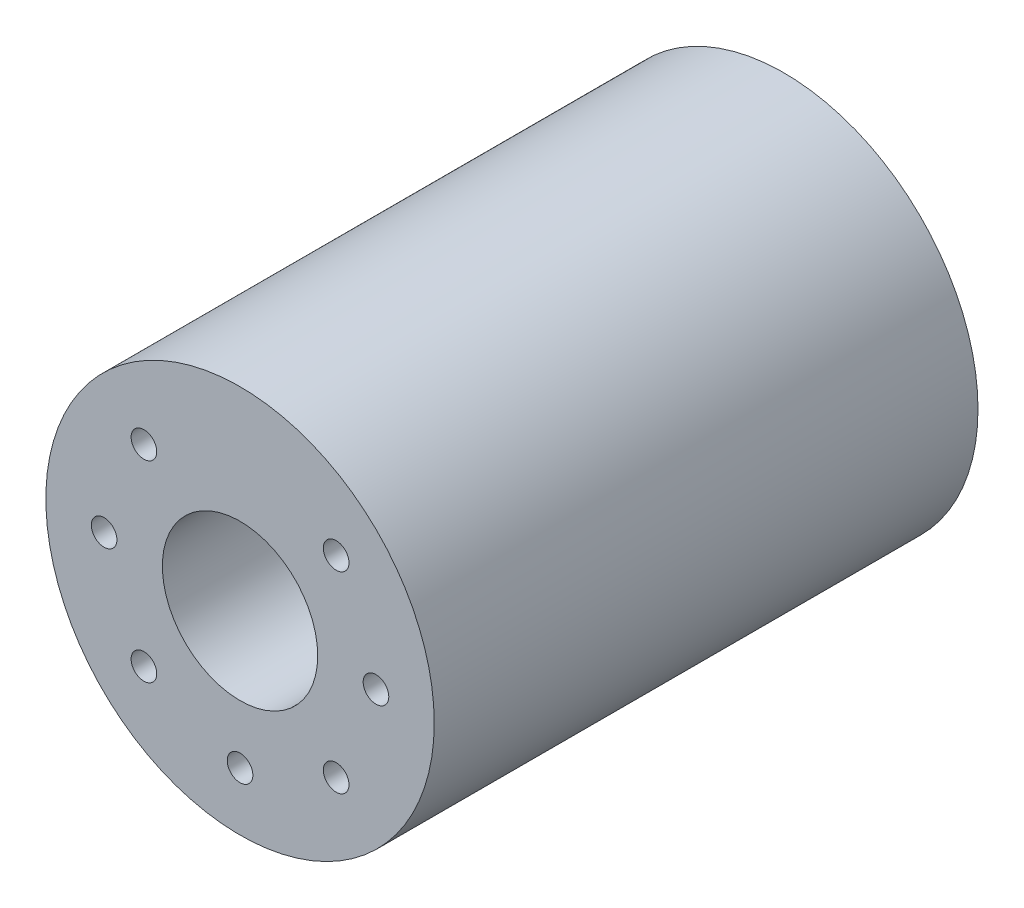
ISO-10303-21;
HEADER;
FILE_DESCRIPTION(('STEP AP214'),'2;1');
FILE_NAME('part.step','',(''),(''),'','','');
FILE_SCHEMA(('AUTOMOTIVE_DESIGN { 1 0 10303 214 1 1 1 1 }'));
ENDSEC;
DATA;
#1=APPLICATION_CONTEXT('core data for automotive mechanical design processes');
#2=APPLICATION_PROTOCOL_DEFINITION('international standard','automotive_design',2000,#1);
#3=PRODUCT_CONTEXT('',#1,'mechanical');
#4=PRODUCT('Part','Part','',(#3));
#5=PRODUCT_RELATED_PRODUCT_CATEGORY('part','',(#4));
#6=PRODUCT_DEFINITION_FORMATION('','',#4);
#7=PRODUCT_DEFINITION_CONTEXT('part definition',#1,'design');
#8=PRODUCT_DEFINITION('design','',#6,#7);
#9=PRODUCT_DEFINITION_SHAPE('','',#8);
#10=(LENGTH_UNIT() NAMED_UNIT(*) SI_UNIT(.MILLI.,.METRE.));
#11=(NAMED_UNIT(*) PLANE_ANGLE_UNIT() SI_UNIT($,.RADIAN.));
#12=(NAMED_UNIT(*) SI_UNIT($,.STERADIAN.) SOLID_ANGLE_UNIT());
#13=UNCERTAINTY_MEASURE_WITH_UNIT(LENGTH_MEASURE(1.E-05),#10,'distance_accuracy_value','');
#14=(GEOMETRIC_REPRESENTATION_CONTEXT(3) GLOBAL_UNCERTAINTY_ASSIGNED_CONTEXT((#13)) GLOBAL_UNIT_ASSIGNED_CONTEXT((#10,
#11,#12)) REPRESENTATION_CONTEXT('',''));
#15=CARTESIAN_POINT('',(0.,0.,0.));
#16=DIRECTION('',(0.,0.,1.));
#17=DIRECTION('',(1.,0.,0.));
#18=AXIS2_PLACEMENT_3D('',#15,#16,#17);
#19=CARTESIAN_POINT('',(0.,0.,70.));
#20=DIRECTION('',(0.,0.,1.));
#21=DIRECTION('',(1.,0.,0.));
#22=AXIS2_PLACEMENT_3D('',#19,#20,#21);
#23=PLANE('',#22);
#24=CARTESIAN_POINT('',(17.5,0.,70.));
#25=DIRECTION('',(0.,0.,1.));
#26=DIRECTION('',(1.,0.,0.));
#27=AXIS2_PLACEMENT_3D('',#24,#25,#26);
#28=CIRCLE('',#27,1.65);
#29=CARTESIAN_POINT('',(19.15,0.,70.));
#30=VERTEX_POINT('',#29);
#31=EDGE_CURVE('E59',#30,#30,#28,.T.);
#32=ORIENTED_EDGE('',*,*,#31,.F.);
#33=EDGE_LOOP('',(#32));
#34=FACE_BOUND('',#33,.T.);
#35=CARTESIAN_POINT('',(12.3743686707645,-12.3743686707646,70.));
#36=DIRECTION('',(0.,0.,1.));
#37=DIRECTION('',(1.,0.,0.));
#38=AXIS2_PLACEMENT_3D('',#35,#36,#37);
#39=CIRCLE('',#38,1.65);
#40=CARTESIAN_POINT('',(14.0243686707645,-12.3743686707646,70.));
#41=VERTEX_POINT('',#40);
#42=EDGE_CURVE('E78',#41,#41,#39,.T.);
#43=ORIENTED_EDGE('',*,*,#42,.F.);
#44=EDGE_LOOP('',(#43));
#45=FACE_BOUND('',#44,.T.);
#46=CARTESIAN_POINT('',(-1.2220184685951E-13,-17.5,70.));
#47=DIRECTION('',(0.,0.,1.));
#48=DIRECTION('',(1.,0.,0.));
#49=AXIS2_PLACEMENT_3D('',#46,#47,#48);
#50=CIRCLE('',#49,1.65);
#51=CARTESIAN_POINT('',(1.64999999999988,-17.5,70.));
#52=VERTEX_POINT('',#51);
#53=EDGE_CURVE('E72',#52,#52,#50,.T.);
#54=ORIENTED_EDGE('',*,*,#53,.F.);
#55=EDGE_LOOP('',(#54));
#56=FACE_BOUND('',#55,.T.);
#57=CARTESIAN_POINT('',(-12.3743686707647,-12.3743686707645,70.));
#58=DIRECTION('',(0.,0.,1.));
#59=DIRECTION('',(1.,0.,0.));
#60=AXIS2_PLACEMENT_3D('',#57,#58,#59);
#61=CIRCLE('',#60,1.65);
#62=CARTESIAN_POINT('',(-10.7243686707647,-12.3743686707645,70.));
#63=VERTEX_POINT('',#62);
#64=EDGE_CURVE('E65',#63,#63,#61,.T.);
#65=ORIENTED_EDGE('',*,*,#64,.F.);
#66=EDGE_LOOP('',(#65));
#67=FACE_BOUND('',#66,.T.);
#68=CARTESIAN_POINT('',(-17.5,1.83302770289264E-13,70.));
#69=DIRECTION('',(0.,0.,1.));
#70=DIRECTION('',(1.,0.,0.));
#71=AXIS2_PLACEMENT_3D('',#68,#69,#70);
#72=CIRCLE('',#71,1.65);
#73=CARTESIAN_POINT('',(-15.85,1.83302770289264E-13,70.));
#74=VERTEX_POINT('',#73);
#75=EDGE_CURVE('E66',#74,#74,#72,.T.);
#76=ORIENTED_EDGE('',*,*,#75,.F.);
#77=EDGE_LOOP('',(#76));
#78=FACE_BOUND('',#77,.T.);
#79=CARTESIAN_POINT('',(-12.3743686707644,12.3743686707647,70.));
#80=DIRECTION('',(0.,0.,1.));
#81=DIRECTION('',(1.,0.,0.));
#82=AXIS2_PLACEMENT_3D('',#79,#80,#81);
#83=CIRCLE('',#82,1.65);
#84=CARTESIAN_POINT('',(-10.7243686707644,12.3743686707647,70.));
#85=VERTEX_POINT('',#84);
#86=EDGE_CURVE('E89',#85,#85,#83,.T.);
#87=ORIENTED_EDGE('',*,*,#86,.F.);
#88=EDGE_LOOP('',(#87));
#89=FACE_BOUND('',#88,.T.);
#90=CARTESIAN_POINT('',(12.3743686707646,12.3743686707646,70.));
#91=DIRECTION('',(0.,0.,1.));
#92=DIRECTION('',(1.,0.,0.));
#93=AXIS2_PLACEMENT_3D('',#90,#91,#92);
#94=CIRCLE('',#93,1.65);
#95=CARTESIAN_POINT('',(14.0243686707646,12.3743686707646,70.));
#96=VERTEX_POINT('',#95);
#97=EDGE_CURVE('E56',#96,#96,#94,.T.);
#98=ORIENTED_EDGE('',*,*,#97,.F.);
#99=EDGE_LOOP('',(#98));
#100=FACE_BOUND('',#99,.T.);
#101=CARTESIAN_POINT('',(0.,0.,70.));
#102=DIRECTION('',(0.,0.,1.));
#103=DIRECTION('',(1.,0.,0.));
#104=AXIS2_PLACEMENT_3D('',#101,#102,#103);
#105=CIRCLE('',#104,25.);
#106=CARTESIAN_POINT('',(25.,0.,70.));
#107=VERTEX_POINT('',#106);
#108=EDGE_CURVE('E10',#107,#107,#105,.T.);
#109=ORIENTED_EDGE('',*,*,#108,.T.);
#110=EDGE_LOOP('',(#109));
#111=FACE_BOUND('',#110,.T.);
#112=CARTESIAN_POINT('',(0.,0.,70.));
#113=DIRECTION('',(0.,0.,1.));
#114=DIRECTION('',(1.,0.,0.));
#115=AXIS2_PLACEMENT_3D('',#112,#113,#114);
#116=CIRCLE('',#115,10.);
#117=CARTESIAN_POINT('',(10.,0.,70.));
#118=VERTEX_POINT('',#117);
#119=EDGE_CURVE('E48',#118,#118,#116,.T.);
#120=ORIENTED_EDGE('',*,*,#119,.F.);
#121=EDGE_LOOP('',(#120));
#122=FACE_BOUND('',#121,.T.);
#123=ADVANCED_FACE('F37',(#34,#45,#56,#67,#78,#89,#100,#111,#122),#23,.T.);
#124=CARTESIAN_POINT('',(0.,0.,0.));
#125=DIRECTION('',(0.,0.,1.));
#126=DIRECTION('',(1.,0.,0.));
#127=AXIS2_PLACEMENT_3D('',#124,#125,#126);
#128=PLANE('',#127);
#129=CARTESIAN_POINT('',(0.,17.5,0.));
#130=DIRECTION('',(0.,0.,-1.));
#131=DIRECTION('',(-1.,0.,0.));
#132=AXIS2_PLACEMENT_3D('',#129,#130,#131);
#133=CIRCLE('',#132,1.65);
#134=CARTESIAN_POINT('',(-1.65,17.5,0.));
#135=VERTEX_POINT('',#134);
#136=EDGE_CURVE('E140',#135,#135,#133,.T.);
#137=ORIENTED_EDGE('',*,*,#136,.F.);
#138=EDGE_LOOP('',(#137));
#139=FACE_BOUND('',#138,.T.);
#140=CARTESIAN_POINT('',(-12.3743686707646,12.3743686707646,0.));
#141=DIRECTION('',(0.,0.,-1.));
#142=DIRECTION('',(-1.,0.,0.));
#143=AXIS2_PLACEMENT_3D('',#140,#141,#142);
#144=CIRCLE('',#143,1.65);
#145=CARTESIAN_POINT('',(-14.0243686707646,12.3743686707646,0.));
#146=VERTEX_POINT('',#145);
#147=EDGE_CURVE('E137',#146,#146,#144,.T.);
#148=ORIENTED_EDGE('',*,*,#147,.F.);
#149=EDGE_LOOP('',(#148));
#150=FACE_BOUND('',#149,.T.);
#151=CARTESIAN_POINT('',(-17.5,0.,0.));
#152=DIRECTION('',(0.,0.,-1.));
#153=DIRECTION('',(-1.,0.,0.));
#154=AXIS2_PLACEMENT_3D('',#151,#152,#153);
#155=CIRCLE('',#154,1.65);
#156=CARTESIAN_POINT('',(-19.15,0.,0.));
#157=VERTEX_POINT('',#156);
#158=EDGE_CURVE('E131',#157,#157,#155,.T.);
#159=ORIENTED_EDGE('',*,*,#158,.F.);
#160=EDGE_LOOP('',(#159));
#161=FACE_BOUND('',#160,.T.);
#162=CARTESIAN_POINT('',(-12.3743686707645,-12.3743686707646,0.));
#163=DIRECTION('',(0.,0.,-1.));
#164=DIRECTION('',(-1.,0.,0.));
#165=AXIS2_PLACEMENT_3D('',#162,#163,#164);
#166=CIRCLE('',#165,1.65);
#167=CARTESIAN_POINT('',(-14.0243686707645,-12.3743686707646,0.));
#168=VERTEX_POINT('',#167);
#169=EDGE_CURVE('E125',#168,#168,#166,.T.);
#170=ORIENTED_EDGE('',*,*,#169,.F.);
#171=EDGE_LOOP('',(#170));
#172=FACE_BOUND('',#171,.T.);
#173=CARTESIAN_POINT('',(1.2220184685951E-13,-17.5,0.));
#174=DIRECTION('',(0.,0.,-1.));
#175=DIRECTION('',(-1.,0.,0.));
#176=AXIS2_PLACEMENT_3D('',#173,#174,#175);
#177=CIRCLE('',#176,1.65);
#178=CARTESIAN_POINT('',(-1.64999999999988,-17.5,0.));
#179=VERTEX_POINT('',#178);
#180=EDGE_CURVE('E119',#179,#179,#177,.T.);
#181=ORIENTED_EDGE('',*,*,#180,.F.);
#182=EDGE_LOOP('',(#181));
#183=FACE_BOUND('',#182,.T.);
#184=CARTESIAN_POINT('',(12.3743686707647,-12.3743686707645,0.));
#185=DIRECTION('',(0.,0.,-1.));
#186=DIRECTION('',(-1.,0.,0.));
#187=AXIS2_PLACEMENT_3D('',#184,#185,#186);
#188=CIRCLE('',#187,1.65);
#189=CARTESIAN_POINT('',(10.7243686707647,-12.3743686707645,0.));
#190=VERTEX_POINT('',#189);
#191=EDGE_CURVE('E113',#190,#190,#188,.T.);
#192=ORIENTED_EDGE('',*,*,#191,.F.);
#193=EDGE_LOOP('',(#192));
#194=FACE_BOUND('',#193,.T.);
#195=CARTESIAN_POINT('',(17.5,1.83302770289264E-13,0.));
#196=DIRECTION('',(0.,0.,-1.));
#197=DIRECTION('',(-1.,0.,0.));
#198=AXIS2_PLACEMENT_3D('',#195,#196,#197);
#199=CIRCLE('',#198,1.65);
#200=CARTESIAN_POINT('',(15.85,1.83302770289264E-13,0.));
#201=VERTEX_POINT('',#200);
#202=EDGE_CURVE('E107',#201,#201,#199,.T.);
#203=ORIENTED_EDGE('',*,*,#202,.F.);
#204=EDGE_LOOP('',(#203));
#205=FACE_BOUND('',#204,.T.);
#206=CARTESIAN_POINT('',(12.3743686707644,12.3743686707647,0.));
#207=DIRECTION('',(0.,0.,-1.));
#208=DIRECTION('',(-1.,0.,0.));
#209=AXIS2_PLACEMENT_3D('',#206,#207,#208);
#210=CIRCLE('',#209,1.65);
#211=CARTESIAN_POINT('',(10.7243686707644,12.3743686707647,0.));
#212=VERTEX_POINT('',#211);
#213=EDGE_CURVE('E101',#212,#212,#210,.T.);
#214=ORIENTED_EDGE('',*,*,#213,.F.);
#215=EDGE_LOOP('',(#214));
#216=FACE_BOUND('',#215,.T.);
#217=CARTESIAN_POINT('',(0.,0.,0.));
#218=DIRECTION('',(0.,0.,1.));
#219=DIRECTION('',(1.,0.,0.));
#220=AXIS2_PLACEMENT_3D('',#217,#218,#219);
#221=CIRCLE('',#220,25.);
#222=CARTESIAN_POINT('',(25.,0.,0.));
#223=VERTEX_POINT('',#222);
#224=EDGE_CURVE('E41',#223,#223,#221,.T.);
#225=ORIENTED_EDGE('',*,*,#224,.F.);
#226=EDGE_LOOP('',(#225));
#227=FACE_BOUND('',#226,.T.);
#228=CARTESIAN_POINT('',(0.,0.,0.));
#229=DIRECTION('',(0.,0.,1.));
#230=DIRECTION('',(1.,0.,0.));
#231=AXIS2_PLACEMENT_3D('',#228,#229,#230);
#232=CIRCLE('',#231,10.);
#233=CARTESIAN_POINT('',(10.,0.,0.));
#234=VERTEX_POINT('',#233);
#235=EDGE_CURVE('E50',#234,#234,#232,.T.);
#236=ORIENTED_EDGE('',*,*,#235,.T.);
#237=EDGE_LOOP('',(#236));
#238=FACE_BOUND('',#237,.T.);
#239=ADVANCED_FACE('F155',(#139,#150,#161,#172,#183,#194,#205,#216,#227,#238),#128,.F.);
#240=CARTESIAN_POINT('',(0.,0.,70.));
#241=DIRECTION('',(0.,0.,-1.));
#242=DIRECTION('',(-1.,0.,0.));
#243=AXIS2_PLACEMENT_3D('',#240,#241,#242);
#244=CYLINDRICAL_SURFACE('',#243,25.);
#245=ORIENTED_EDGE('',*,*,#108,.F.);
#246=EDGE_LOOP('',(#245));
#247=FACE_BOUND('',#246,.T.);
#248=ORIENTED_EDGE('',*,*,#224,.T.);
#249=EDGE_LOOP('',(#248));
#250=FACE_BOUND('',#249,.T.);
#251=ADVANCED_FACE('F39',(#247,#250),#244,.T.);
#252=CARTESIAN_POINT('',(0.,0.,70.));
#253=DIRECTION('',(0.,0.,-1.));
#254=DIRECTION('',(-1.,0.,0.));
#255=AXIS2_PLACEMENT_3D('',#252,#253,#254);
#256=CYLINDRICAL_SURFACE('',#255,10.);
#257=ORIENTED_EDGE('',*,*,#119,.T.);
#258=EDGE_LOOP('',(#257));
#259=FACE_BOUND('',#258,.T.);
#260=ORIENTED_EDGE('',*,*,#235,.F.);
#261=EDGE_LOOP('',(#260));
#262=FACE_BOUND('',#261,.T.);
#263=ADVANCED_FACE('F176',(#259,#262),#256,.F.);
#264=CARTESIAN_POINT('',(12.3743686707646,12.3743686707646,50.));
#265=DIRECTION('',(0.,0.,1.));
#266=DIRECTION('',(1.,0.,0.));
#267=AXIS2_PLACEMENT_3D('',#264,#265,#266);
#268=CYLINDRICAL_SURFACE('',#267,1.65);
#269=CARTESIAN_POINT('',(12.3743686707646,12.3743686707646,50.));
#270=DIRECTION('',(0.,0.,1.));
#271=DIRECTION('',(1.,0.,0.));
#272=AXIS2_PLACEMENT_3D('',#269,#270,#271);
#273=CIRCLE('',#272,1.65);
#274=CARTESIAN_POINT('',(14.0243686707646,12.3743686707646,50.));
#275=VERTEX_POINT('',#274);
#276=EDGE_CURVE('E53',#275,#275,#273,.T.);
#277=ORIENTED_EDGE('',*,*,#276,.F.);
#278=EDGE_LOOP('',(#277));
#279=FACE_BOUND('',#278,.T.);
#280=ORIENTED_EDGE('',*,*,#97,.T.);
#281=EDGE_LOOP('',(#280));
#282=FACE_BOUND('',#281,.T.);
#283=ADVANCED_FACE('F178',(#279,#282),#268,.F.);
#284=CARTESIAN_POINT('',(12.3743686707646,12.3743686707646,50.));
#285=DIRECTION('',(0.,0.,1.));
#286=DIRECTION('',(1.,0.,0.));
#287=AXIS2_PLACEMENT_3D('',#284,#285,#286);
#288=PLANE('',#287);
#289=ORIENTED_EDGE('',*,*,#276,.T.);
#290=EDGE_LOOP('',(#289));
#291=FACE_BOUND('',#290,.T.);
#292=ADVANCED_FACE('F186',(#291),#288,.T.);
#293=CARTESIAN_POINT('',(-12.3743686707644,12.3743686707647,50.));
#294=DIRECTION('',(0.,0.,1.));
#295=DIRECTION('',(1.,0.,0.));
#296=AXIS2_PLACEMENT_3D('',#293,#294,#295);
#297=CYLINDRICAL_SURFACE('',#296,1.65);
#298=CARTESIAN_POINT('',(-12.3743686707644,12.3743686707647,50.));
#299=DIRECTION('',(0.,0.,1.));
#300=DIRECTION('',(1.,0.,0.));
#301=AXIS2_PLACEMENT_3D('',#298,#299,#300);
#302=CIRCLE('',#301,1.65);
#303=CARTESIAN_POINT('',(-10.7243686707644,12.3743686707647,50.));
#304=VERTEX_POINT('',#303);
#305=EDGE_CURVE('E86',#304,#304,#302,.T.);
#306=ORIENTED_EDGE('',*,*,#305,.F.);
#307=EDGE_LOOP('',(#306));
#308=FACE_BOUND('',#307,.T.);
#309=ORIENTED_EDGE('',*,*,#86,.T.);
#310=EDGE_LOOP('',(#309));
#311=FACE_BOUND('',#310,.T.);
#312=ADVANCED_FACE('F211',(#308,#311),#297,.F.);
#313=CARTESIAN_POINT('',(-12.3743686707644,12.3743686707647,50.));
#314=DIRECTION('',(0.,0.,1.));
#315=DIRECTION('',(1.,0.,0.));
#316=AXIS2_PLACEMENT_3D('',#313,#314,#315);
#317=PLANE('',#316);
#318=ORIENTED_EDGE('',*,*,#305,.T.);
#319=EDGE_LOOP('',(#318));
#320=FACE_BOUND('',#319,.T.);
#321=ADVANCED_FACE('F213',(#320),#317,.T.);
#322=CARTESIAN_POINT('',(-17.5,1.83302770289264E-13,50.));
#323=DIRECTION('',(0.,0.,1.));
#324=DIRECTION('',(1.,0.,0.));
#325=AXIS2_PLACEMENT_3D('',#322,#323,#324);
#326=CYLINDRICAL_SURFACE('',#325,1.65);
#327=CARTESIAN_POINT('',(-17.5,1.83302770289264E-13,50.));
#328=DIRECTION('',(0.,0.,1.));
#329=DIRECTION('',(1.,0.,0.));
#330=AXIS2_PLACEMENT_3D('',#327,#328,#329);
#331=CIRCLE('',#330,1.65);
#332=CARTESIAN_POINT('',(-15.85,1.83302770289264E-13,50.));
#333=VERTEX_POINT('',#332);
#334=EDGE_CURVE('E93',#333,#333,#331,.T.);
#335=ORIENTED_EDGE('',*,*,#334,.F.);
#336=EDGE_LOOP('',(#335));
#337=FACE_BOUND('',#336,.T.);
#338=ORIENTED_EDGE('',*,*,#75,.T.);
#339=EDGE_LOOP('',(#338));
#340=FACE_BOUND('',#339,.T.);
#341=ADVANCED_FACE('F220',(#337,#340),#326,.F.);
#342=CARTESIAN_POINT('',(-17.5,1.83302770289264E-13,50.));
#343=DIRECTION('',(0.,0.,1.));
#344=DIRECTION('',(1.,0.,0.));
#345=AXIS2_PLACEMENT_3D('',#342,#343,#344);
#346=PLANE('',#345);
#347=ORIENTED_EDGE('',*,*,#334,.T.);
#348=EDGE_LOOP('',(#347));
#349=FACE_BOUND('',#348,.T.);
#350=ADVANCED_FACE('F227',(#349),#346,.T.);
#351=CARTESIAN_POINT('',(-12.3743686707647,-12.3743686707645,50.));
#352=DIRECTION('',(0.,0.,1.));
#353=DIRECTION('',(1.,0.,0.));
#354=AXIS2_PLACEMENT_3D('',#351,#352,#353);
#355=CYLINDRICAL_SURFACE('',#354,1.65);
#356=CARTESIAN_POINT('',(-12.3743686707647,-12.3743686707645,50.));
#357=DIRECTION('',(0.,0.,1.));
#358=DIRECTION('',(1.,0.,0.));
#359=AXIS2_PLACEMENT_3D('',#356,#357,#358);
#360=CIRCLE('',#359,1.65);
#361=CARTESIAN_POINT('',(-10.7243686707647,-12.3743686707645,50.));
#362=VERTEX_POINT('',#361);
#363=EDGE_CURVE('E62',#362,#362,#360,.T.);
#364=ORIENTED_EDGE('',*,*,#363,.F.);
#365=EDGE_LOOP('',(#364));
#366=FACE_BOUND('',#365,.T.);
#367=ORIENTED_EDGE('',*,*,#64,.T.);
#368=EDGE_LOOP('',(#367));
#369=FACE_BOUND('',#368,.T.);
#370=ADVANCED_FACE('F256',(#366,#369),#355,.F.);
#371=CARTESIAN_POINT('',(-12.3743686707647,-12.3743686707645,50.));
#372=DIRECTION('',(0.,0.,1.));
#373=DIRECTION('',(1.,0.,0.));
#374=AXIS2_PLACEMENT_3D('',#371,#372,#373);
#375=PLANE('',#374);
#376=ORIENTED_EDGE('',*,*,#363,.T.);
#377=EDGE_LOOP('',(#376));
#378=FACE_BOUND('',#377,.T.);
#379=ADVANCED_FACE('F251',(#378),#375,.T.);
#380=CARTESIAN_POINT('',(-1.2220184685951E-13,-17.5,50.));
#381=DIRECTION('',(0.,0.,1.));
#382=DIRECTION('',(1.,0.,0.));
#383=AXIS2_PLACEMENT_3D('',#380,#381,#382);
#384=CYLINDRICAL_SURFACE('',#383,1.65);
#385=CARTESIAN_POINT('',(-1.2220184685951E-13,-17.5,50.));
#386=DIRECTION('',(0.,0.,1.));
#387=DIRECTION('',(1.,0.,0.));
#388=AXIS2_PLACEMENT_3D('',#385,#386,#387);
#389=CIRCLE('',#388,1.65);
#390=CARTESIAN_POINT('',(1.64999999999988,-17.5,50.));
#391=VERTEX_POINT('',#390);
#392=EDGE_CURVE('E69',#391,#391,#389,.T.);
#393=ORIENTED_EDGE('',*,*,#392,.F.);
#394=EDGE_LOOP('',(#393));
#395=FACE_BOUND('',#394,.T.);
#396=ORIENTED_EDGE('',*,*,#53,.T.);
#397=EDGE_LOOP('',(#396));
#398=FACE_BOUND('',#397,.T.);
#399=ADVANCED_FACE('F248',(#395,#398),#384,.F.);
#400=CARTESIAN_POINT('',(-1.2220184685951E-13,-17.5,50.));
#401=DIRECTION('',(0.,0.,1.));
#402=DIRECTION('',(1.,0.,0.));
#403=AXIS2_PLACEMENT_3D('',#400,#401,#402);
#404=PLANE('',#403);
#405=ORIENTED_EDGE('',*,*,#392,.T.);
#406=EDGE_LOOP('',(#405));
#407=FACE_BOUND('',#406,.T.);
#408=ADVANCED_FACE('F243',(#407),#404,.T.);
#409=CARTESIAN_POINT('',(12.3743686707645,-12.3743686707646,50.));
#410=DIRECTION('',(0.,0.,1.));
#411=DIRECTION('',(1.,0.,0.));
#412=AXIS2_PLACEMENT_3D('',#409,#410,#411);
#413=CYLINDRICAL_SURFACE('',#412,1.65);
#414=CARTESIAN_POINT('',(12.3743686707645,-12.3743686707646,50.));
#415=DIRECTION('',(0.,0.,1.));
#416=DIRECTION('',(1.,0.,0.));
#417=AXIS2_PLACEMENT_3D('',#414,#415,#416);
#418=CIRCLE('',#417,1.65);
#419=CARTESIAN_POINT('',(14.0243686707645,-12.3743686707646,50.));
#420=VERTEX_POINT('',#419);
#421=EDGE_CURVE('E75',#420,#420,#418,.T.);
#422=ORIENTED_EDGE('',*,*,#421,.F.);
#423=EDGE_LOOP('',(#422));
#424=FACE_BOUND('',#423,.T.);
#425=ORIENTED_EDGE('',*,*,#42,.T.);
#426=EDGE_LOOP('',(#425));
#427=FACE_BOUND('',#426,.T.);
#428=ADVANCED_FACE('F240',(#424,#427),#413,.F.);
#429=CARTESIAN_POINT('',(12.3743686707645,-12.3743686707646,50.));
#430=DIRECTION('',(0.,0.,1.));
#431=DIRECTION('',(1.,0.,0.));
#432=AXIS2_PLACEMENT_3D('',#429,#430,#431);
#433=PLANE('',#432);
#434=ORIENTED_EDGE('',*,*,#421,.T.);
#435=EDGE_LOOP('',(#434));
#436=FACE_BOUND('',#435,.T.);
#437=ADVANCED_FACE('F234',(#436),#433,.T.);
#438=CARTESIAN_POINT('',(17.5,0.,50.));
#439=DIRECTION('',(0.,0.,1.));
#440=DIRECTION('',(1.,0.,0.));
#441=AXIS2_PLACEMENT_3D('',#438,#439,#440);
#442=CYLINDRICAL_SURFACE('',#441,1.65);
#443=CARTESIAN_POINT('',(17.5,0.,50.));
#444=DIRECTION('',(0.,0.,1.));
#445=DIRECTION('',(1.,0.,0.));
#446=AXIS2_PLACEMENT_3D('',#443,#444,#445);
#447=CIRCLE('',#446,1.65);
#448=CARTESIAN_POINT('',(19.15,0.,50.));
#449=VERTEX_POINT('',#448);
#450=EDGE_CURVE('E81',#449,#449,#447,.T.);
#451=ORIENTED_EDGE('',*,*,#450,.F.);
#452=EDGE_LOOP('',(#451));
#453=FACE_BOUND('',#452,.T.);
#454=ORIENTED_EDGE('',*,*,#31,.T.);
#455=EDGE_LOOP('',(#454));
#456=FACE_BOUND('',#455,.T.);
#457=ADVANCED_FACE('F230',(#453,#456),#442,.F.);
#458=CARTESIAN_POINT('',(17.5,0.,50.));
#459=DIRECTION('',(0.,0.,1.));
#460=DIRECTION('',(1.,0.,0.));
#461=AXIS2_PLACEMENT_3D('',#458,#459,#460);
#462=PLANE('',#461);
#463=ORIENTED_EDGE('',*,*,#450,.T.);
#464=EDGE_LOOP('',(#463));
#465=FACE_BOUND('',#464,.T.);
#466=ADVANCED_FACE('F233',(#465),#462,.T.);
#467=CARTESIAN_POINT('',(12.3743686707644,12.3743686707647,20.));
#468=DIRECTION('',(0.,0.,-1.));
#469=DIRECTION('',(-1.,0.,0.));
#470=AXIS2_PLACEMENT_3D('',#467,#468,#469);
#471=CYLINDRICAL_SURFACE('',#470,1.65);
#472=CARTESIAN_POINT('',(12.3743686707644,12.3743686707647,20.));
#473=DIRECTION('',(0.,0.,-1.));
#474=DIRECTION('',(-1.,0.,0.));
#475=AXIS2_PLACEMENT_3D('',#472,#473,#474);
#476=CIRCLE('',#475,1.65);
#477=CARTESIAN_POINT('',(10.7243686707644,12.3743686707647,20.));
#478=VERTEX_POINT('',#477);
#479=EDGE_CURVE('E98',#478,#478,#476,.T.);
#480=ORIENTED_EDGE('',*,*,#479,.F.);
#481=EDGE_LOOP('',(#480));
#482=FACE_BOUND('',#481,.T.);
#483=ORIENTED_EDGE('',*,*,#213,.T.);
#484=EDGE_LOOP('',(#483));
#485=FACE_BOUND('',#484,.T.);
#486=ADVANCED_FACE('F238',(#482,#485),#471,.F.);
#487=CARTESIAN_POINT('',(12.3743686707644,12.3743686707647,20.));
#488=DIRECTION('',(0.,0.,-1.));
#489=DIRECTION('',(-1.,0.,0.));
#490=AXIS2_PLACEMENT_3D('',#487,#488,#489);
#491=PLANE('',#490);
#492=ORIENTED_EDGE('',*,*,#479,.T.);
#493=EDGE_LOOP('',(#492));
#494=FACE_BOUND('',#493,.T.);
#495=ADVANCED_FACE('F312',(#494),#491,.T.);
#496=CARTESIAN_POINT('',(17.5,1.83302770289264E-13,20.));
#497=DIRECTION('',(0.,0.,-1.));
#498=DIRECTION('',(-1.,0.,0.));
#499=AXIS2_PLACEMENT_3D('',#496,#497,#498);
#500=CYLINDRICAL_SURFACE('',#499,1.65);
#501=CARTESIAN_POINT('',(17.5,1.83302770289264E-13,20.));
#502=DIRECTION('',(0.,0.,-1.));
#503=DIRECTION('',(-1.,0.,0.));
#504=AXIS2_PLACEMENT_3D('',#501,#502,#503);
#505=CIRCLE('',#504,1.65);
#506=CARTESIAN_POINT('',(15.85,1.83302770289264E-13,20.));
#507=VERTEX_POINT('',#506);
#508=EDGE_CURVE('E104',#507,#507,#505,.T.);
#509=ORIENTED_EDGE('',*,*,#508,.F.);
#510=EDGE_LOOP('',(#509));
#511=FACE_BOUND('',#510,.T.);
#512=ORIENTED_EDGE('',*,*,#202,.T.);
#513=EDGE_LOOP('',(#512));
#514=FACE_BOUND('',#513,.T.);
#515=ADVANCED_FACE('F321',(#511,#514),#500,.F.);
#516=CARTESIAN_POINT('',(0.,0.,20.));
#517=DIRECTION('',(0.,0.,-1.));
#518=DIRECTION('',(-1.,0.,0.));
#519=AXIS2_PLACEMENT_3D('',#516,#517,#518);
#520=PLANE('',#519);
#521=ORIENTED_EDGE('',*,*,#508,.T.);
#522=EDGE_LOOP('',(#521));
#523=FACE_BOUND('',#522,.T.);
#524=ADVANCED_FACE('F330',(#523),#520,.T.);
#525=CARTESIAN_POINT('',(12.3743686707647,-12.3743686707645,20.));
#526=DIRECTION('',(0.,0.,-1.));
#527=DIRECTION('',(-1.,0.,0.));
#528=AXIS2_PLACEMENT_3D('',#525,#526,#527);
#529=CYLINDRICAL_SURFACE('',#528,1.65);
#530=CARTESIAN_POINT('',(12.3743686707647,-12.3743686707645,20.));
#531=DIRECTION('',(0.,0.,-1.));
#532=DIRECTION('',(-1.,0.,0.));
#533=AXIS2_PLACEMENT_3D('',#530,#531,#532);
#534=CIRCLE('',#533,1.65);
#535=CARTESIAN_POINT('',(10.7243686707647,-12.3743686707645,20.));
#536=VERTEX_POINT('',#535);
#537=EDGE_CURVE('E110',#536,#536,#534,.T.);
#538=ORIENTED_EDGE('',*,*,#537,.F.);
#539=EDGE_LOOP('',(#538));
#540=FACE_BOUND('',#539,.T.);
#541=ORIENTED_EDGE('',*,*,#191,.T.);
#542=EDGE_LOOP('',(#541));
#543=FACE_BOUND('',#542,.T.);
#544=ADVANCED_FACE('F339',(#540,#543),#529,.F.);
#545=CARTESIAN_POINT('',(0.,0.,20.));
#546=DIRECTION('',(0.,0.,-1.));
#547=DIRECTION('',(-1.,0.,0.));
#548=AXIS2_PLACEMENT_3D('',#545,#546,#547);
#549=PLANE('',#548);
#550=ORIENTED_EDGE('',*,*,#537,.T.);
#551=EDGE_LOOP('',(#550));
#552=FACE_BOUND('',#551,.T.);
#553=ADVANCED_FACE('F348',(#552),#549,.T.);
#554=CARTESIAN_POINT('',(1.2220184685951E-13,-17.5,20.));
#555=DIRECTION('',(0.,0.,-1.));
#556=DIRECTION('',(-1.,0.,0.));
#557=AXIS2_PLACEMENT_3D('',#554,#555,#556);
#558=CYLINDRICAL_SURFACE('',#557,1.65);
#559=CARTESIAN_POINT('',(1.2220184685951E-13,-17.5,20.));
#560=DIRECTION('',(0.,0.,-1.));
#561=DIRECTION('',(-1.,0.,0.));
#562=AXIS2_PLACEMENT_3D('',#559,#560,#561);
#563=CIRCLE('',#562,1.65);
#564=CARTESIAN_POINT('',(-1.64999999999988,-17.5,20.));
#565=VERTEX_POINT('',#564);
#566=EDGE_CURVE('E116',#565,#565,#563,.T.);
#567=ORIENTED_EDGE('',*,*,#566,.F.);
#568=EDGE_LOOP('',(#567));
#569=FACE_BOUND('',#568,.T.);
#570=ORIENTED_EDGE('',*,*,#180,.T.);
#571=EDGE_LOOP('',(#570));
#572=FACE_BOUND('',#571,.T.);
#573=ADVANCED_FACE('F357',(#569,#572),#558,.F.);
#574=CARTESIAN_POINT('',(0.,0.,20.));
#575=DIRECTION('',(0.,0.,-1.));
#576=DIRECTION('',(-1.,0.,0.));
#577=AXIS2_PLACEMENT_3D('',#574,#575,#576);
#578=PLANE('',#577);
#579=ORIENTED_EDGE('',*,*,#566,.T.);
#580=EDGE_LOOP('',(#579));
#581=FACE_BOUND('',#580,.T.);
#582=ADVANCED_FACE('F366',(#581),#578,.T.);
#583=CARTESIAN_POINT('',(-12.3743686707645,-12.3743686707646,20.));
#584=DIRECTION('',(0.,0.,-1.));
#585=DIRECTION('',(-1.,0.,0.));
#586=AXIS2_PLACEMENT_3D('',#583,#584,#585);
#587=CYLINDRICAL_SURFACE('',#586,1.65);
#588=CARTESIAN_POINT('',(-12.3743686707645,-12.3743686707646,20.));
#589=DIRECTION('',(0.,0.,-1.));
#590=DIRECTION('',(-1.,0.,0.));
#591=AXIS2_PLACEMENT_3D('',#588,#589,#590);
#592=CIRCLE('',#591,1.65);
#593=CARTESIAN_POINT('',(-14.0243686707645,-12.3743686707646,20.));
#594=VERTEX_POINT('',#593);
#595=EDGE_CURVE('E122',#594,#594,#592,.T.);
#596=ORIENTED_EDGE('',*,*,#595,.F.);
#597=EDGE_LOOP('',(#596));
#598=FACE_BOUND('',#597,.T.);
#599=ORIENTED_EDGE('',*,*,#169,.T.);
#600=EDGE_LOOP('',(#599));
#601=FACE_BOUND('',#600,.T.);
#602=ADVANCED_FACE('F375',(#598,#601),#587,.F.);
#603=CARTESIAN_POINT('',(0.,0.,20.));
#604=DIRECTION('',(0.,0.,-1.));
#605=DIRECTION('',(-1.,0.,0.));
#606=AXIS2_PLACEMENT_3D('',#603,#604,#605);
#607=PLANE('',#606);
#608=ORIENTED_EDGE('',*,*,#595,.T.);
#609=EDGE_LOOP('',(#608));
#610=FACE_BOUND('',#609,.T.);
#611=ADVANCED_FACE('F384',(#610),#607,.T.);
#612=CARTESIAN_POINT('',(-17.5,0.,20.));
#613=DIRECTION('',(0.,0.,-1.));
#614=DIRECTION('',(-1.,0.,0.));
#615=AXIS2_PLACEMENT_3D('',#612,#613,#614);
#616=CYLINDRICAL_SURFACE('',#615,1.65);
#617=CARTESIAN_POINT('',(-17.5,0.,20.));
#618=DIRECTION('',(0.,0.,-1.));
#619=DIRECTION('',(-1.,0.,0.));
#620=AXIS2_PLACEMENT_3D('',#617,#618,#619);
#621=CIRCLE('',#620,1.65);
#622=CARTESIAN_POINT('',(-19.15,0.,20.));
#623=VERTEX_POINT('',#622);
#624=EDGE_CURVE('E128',#623,#623,#621,.T.);
#625=ORIENTED_EDGE('',*,*,#624,.F.);
#626=EDGE_LOOP('',(#625));
#627=FACE_BOUND('',#626,.T.);
#628=ORIENTED_EDGE('',*,*,#158,.T.);
#629=EDGE_LOOP('',(#628));
#630=FACE_BOUND('',#629,.T.);
#631=ADVANCED_FACE('F393',(#627,#630),#616,.F.);
#632=CARTESIAN_POINT('',(0.,0.,20.));
#633=DIRECTION('',(0.,0.,-1.));
#634=DIRECTION('',(-1.,0.,0.));
#635=AXIS2_PLACEMENT_3D('',#632,#633,#634);
#636=PLANE('',#635);
#637=ORIENTED_EDGE('',*,*,#624,.T.);
#638=EDGE_LOOP('',(#637));
#639=FACE_BOUND('',#638,.T.);
#640=ADVANCED_FACE('F402',(#639),#636,.T.);
#641=CARTESIAN_POINT('',(-12.3743686707646,12.3743686707646,20.));
#642=DIRECTION('',(0.,0.,-1.));
#643=DIRECTION('',(-1.,0.,0.));
#644=AXIS2_PLACEMENT_3D('',#641,#642,#643);
#645=CYLINDRICAL_SURFACE('',#644,1.65);
#646=CARTESIAN_POINT('',(-12.3743686707646,12.3743686707646,20.));
#647=DIRECTION('',(0.,0.,-1.));
#648=DIRECTION('',(-1.,0.,0.));
#649=AXIS2_PLACEMENT_3D('',#646,#647,#648);
#650=CIRCLE('',#649,1.65);
#651=CARTESIAN_POINT('',(-14.0243686707646,12.3743686707646,20.));
#652=VERTEX_POINT('',#651);
#653=EDGE_CURVE('E134',#652,#652,#650,.T.);
#654=ORIENTED_EDGE('',*,*,#653,.F.);
#655=EDGE_LOOP('',(#654));
#656=FACE_BOUND('',#655,.T.);
#657=ORIENTED_EDGE('',*,*,#147,.T.);
#658=EDGE_LOOP('',(#657));
#659=FACE_BOUND('',#658,.T.);
#660=ADVANCED_FACE('F411',(#656,#659),#645,.F.);
#661=CARTESIAN_POINT('',(0.,0.,20.));
#662=DIRECTION('',(0.,0.,-1.));
#663=DIRECTION('',(-1.,0.,0.));
#664=AXIS2_PLACEMENT_3D('',#661,#662,#663);
#665=PLANE('',#664);
#666=ORIENTED_EDGE('',*,*,#653,.T.);
#667=EDGE_LOOP('',(#666));
#668=FACE_BOUND('',#667,.T.);
#669=ADVANCED_FACE('F151',(#668),#665,.T.);
#670=CARTESIAN_POINT('',(0.,17.5,20.));
#671=DIRECTION('',(0.,0.,-1.));
#672=DIRECTION('',(-1.,0.,0.));
#673=AXIS2_PLACEMENT_3D('',#670,#671,#672);
#674=CYLINDRICAL_SURFACE('',#673,1.65);
#675=CARTESIAN_POINT('',(0.,17.5,20.));
#676=DIRECTION('',(0.,0.,-1.));
#677=DIRECTION('',(-1.,0.,0.));
#678=AXIS2_PLACEMENT_3D('',#675,#676,#677);
#679=CIRCLE('',#678,1.65);
#680=CARTESIAN_POINT('',(-1.65,17.5,20.));
#681=VERTEX_POINT('',#680);
#682=EDGE_CURVE('E90',#681,#681,#679,.T.);
#683=ORIENTED_EDGE('',*,*,#682,.F.);
#684=EDGE_LOOP('',(#683));
#685=FACE_BOUND('',#684,.T.);
#686=ORIENTED_EDGE('',*,*,#136,.T.);
#687=EDGE_LOOP('',(#686));
#688=FACE_BOUND('',#687,.T.);
#689=ADVANCED_FACE('F148',(#685,#688),#674,.F.);
#690=CARTESIAN_POINT('',(0.,0.,20.));
#691=DIRECTION('',(0.,0.,-1.));
#692=DIRECTION('',(-1.,0.,0.));
#693=AXIS2_PLACEMENT_3D('',#690,#691,#692);
#694=PLANE('',#693);
#695=ORIENTED_EDGE('',*,*,#682,.T.);
#696=EDGE_LOOP('',(#695));
#697=FACE_BOUND('',#696,.T.);
#698=ADVANCED_FACE('F146',(#697),#694,.T.);
#699=CLOSED_SHELL('',(#123,#239,#251,#263,#283,#292,#312,#321,#341,#350,#370,#379,#399,#408,
#428,#437,#457,#466,#486,#495,#515,#524,#544,#553,#573,#582,#602,#611,#631,#640,#660,#669,#689,#698));
#700=MANIFOLD_SOLID_BREP('B2',#699);
#701=ADVANCED_BREP_SHAPE_REPRESENTATION('',(#18,#700),#14);
#702=SHAPE_DEFINITION_REPRESENTATION(#9,#701);
ENDSEC;
END-ISO-10303-21;
